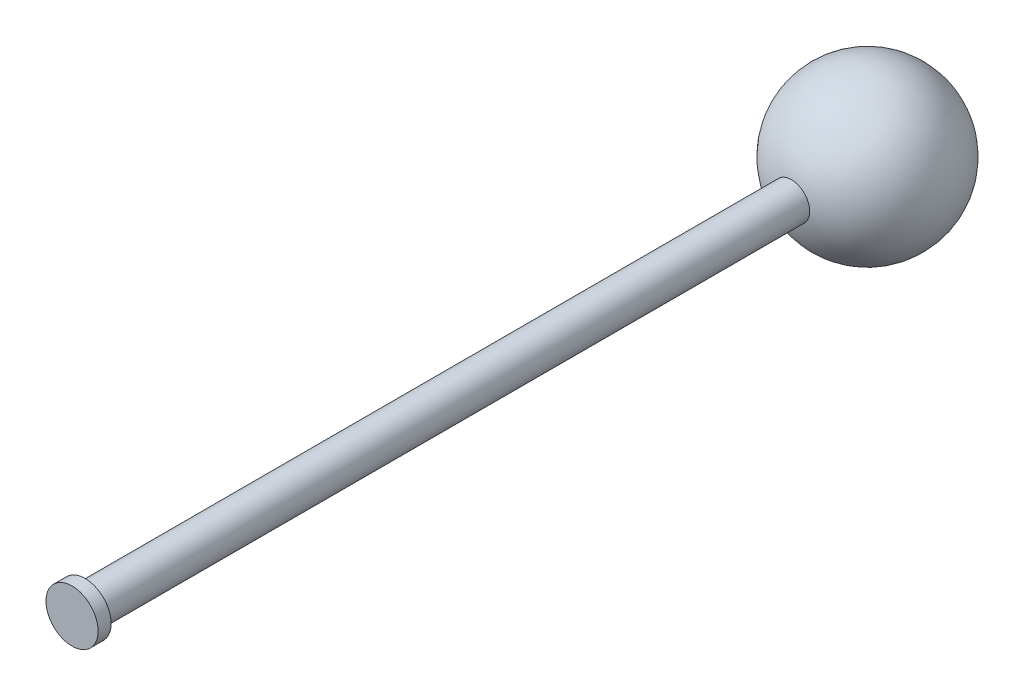
ISO-10303-21;
HEADER;
FILE_DESCRIPTION(('STEP AP214'),'2;1');
FILE_NAME('part.step','',(''),(''),'','','');
FILE_SCHEMA(('AUTOMOTIVE_DESIGN { 1 0 10303 214 1 1 1 1 }'));
ENDSEC;
DATA;
#1=APPLICATION_CONTEXT('core data for automotive mechanical design processes');
#2=APPLICATION_PROTOCOL_DEFINITION('international standard','automotive_design',2000,#1);
#3=PRODUCT_CONTEXT('',#1,'mechanical');
#4=PRODUCT('Part','Part','',(#3));
#5=PRODUCT_RELATED_PRODUCT_CATEGORY('part','',(#4));
#6=PRODUCT_DEFINITION_FORMATION('','',#4);
#7=PRODUCT_DEFINITION_CONTEXT('part definition',#1,'design');
#8=PRODUCT_DEFINITION('design','',#6,#7);
#9=PRODUCT_DEFINITION_SHAPE('','',#8);
#10=(LENGTH_UNIT() NAMED_UNIT(*) SI_UNIT(.MILLI.,.METRE.));
#11=(NAMED_UNIT(*) PLANE_ANGLE_UNIT() SI_UNIT($,.RADIAN.));
#12=(NAMED_UNIT(*) SI_UNIT($,.STERADIAN.) SOLID_ANGLE_UNIT());
#13=UNCERTAINTY_MEASURE_WITH_UNIT(LENGTH_MEASURE(1.E-05),#10,'distance_accuracy_value','');
#14=(GEOMETRIC_REPRESENTATION_CONTEXT(3) GLOBAL_UNCERTAINTY_ASSIGNED_CONTEXT((#13)) GLOBAL_UNIT_ASSIGNED_CONTEXT((#10,
#11,#12)) REPRESENTATION_CONTEXT('',''));
#15=CARTESIAN_POINT('',(0.,0.,0.));
#16=DIRECTION('',(0.,0.,1.));
#17=DIRECTION('',(1.,0.,0.));
#18=AXIS2_PLACEMENT_3D('',#15,#16,#17);
#19=CARTESIAN_POINT('',(0.,0.,0.));
#20=DIRECTION('',(0.,1.,0.));
#21=DIRECTION('',(1.,0.,0.));
#22=AXIS2_PLACEMENT_3D('',#19,#20,#21);
#23=SPHERICAL_SURFACE('',#22,3.);
#24=CARTESIAN_POINT('',(0.,0.,0.));
#25=DIRECTION('',(0.,0.,-1.));
#26=DIRECTION('',(-1.,0.,0.));
#27=AXIS2_PLACEMENT_3D('',#24,#25,#26);
#28=SPHERICAL_SURFACE('',#27,3.);
#29=CARTESIAN_POINT('',(0.,0.,2.91719042916296));
#30=DIRECTION('',(0.,0.,-1.));
#31=DIRECTION('',(-1.,0.,0.));
#32=AXIS2_PLACEMENT_3D('',#29,#30,#31);
#33=CIRCLE('',#32,0.7);
#34=CARTESIAN_POINT('',(-0.7,0.,2.91719042916296));
#35=VERTEX_POINT('',#34);
#36=EDGE_CURVE('E10',#35,#35,#33,.F.);
#37=ORIENTED_EDGE('',*,*,#36,.F.);
#38=EDGE_LOOP('',(#37));
#39=FACE_BOUND('',#38,.T.);
#40=ADVANCED_FACE('F37',(#39),#28,.T.);
#41=CARTESIAN_POINT('',(0.,0.,30.));
#42=DIRECTION('',(0.,0.,-1.));
#43=DIRECTION('',(-1.,0.,0.));
#44=AXIS2_PLACEMENT_3D('',#41,#42,#43);
#45=CYLINDRICAL_SURFACE('',#44,0.7);
#46=CARTESIAN_POINT('',(0.,0.,30.));
#47=DIRECTION('',(0.,0.,1.));
#48=DIRECTION('',(1.,0.,0.));
#49=AXIS2_PLACEMENT_3D('',#46,#47,#48);
#50=CIRCLE('',#49,0.7);
#51=CARTESIAN_POINT('',(0.7,0.,30.));
#52=VERTEX_POINT('',#51);
#53=EDGE_CURVE('E44',#52,#52,#50,.T.);
#54=ORIENTED_EDGE('',*,*,#53,.F.);
#55=EDGE_LOOP('',(#54));
#56=FACE_BOUND('',#55,.T.);
#57=ORIENTED_EDGE('',*,*,#36,.T.);
#58=EDGE_LOOP('',(#57));
#59=FACE_BOUND('',#58,.T.);
#60=ADVANCED_FACE('F74',(#56,#59),#45,.T.);
#61=CARTESIAN_POINT('',(0.,0.,30.5));
#62=DIRECTION('',(0.,0.,-1.));
#63=DIRECTION('',(-1.,0.,0.));
#64=AXIS2_PLACEMENT_3D('',#61,#62,#63);
#65=CYLINDRICAL_SURFACE('',#64,1.);
#66=CARTESIAN_POINT('',(0.,0.,30.5));
#67=DIRECTION('',(0.,0.,1.));
#68=DIRECTION('',(1.,0.,0.));
#69=AXIS2_PLACEMENT_3D('',#66,#67,#68);
#70=CIRCLE('',#69,1.);
#71=CARTESIAN_POINT('',(1.,0.,30.5));
#72=VERTEX_POINT('',#71);
#73=EDGE_CURVE('E49',#72,#72,#70,.T.);
#74=ORIENTED_EDGE('',*,*,#73,.F.);
#75=EDGE_LOOP('',(#74));
#76=FACE_BOUND('',#75,.T.);
#77=CARTESIAN_POINT('',(0.,0.,30.));
#78=DIRECTION('',(0.,0.,1.));
#79=DIRECTION('',(1.,0.,0.));
#80=AXIS2_PLACEMENT_3D('',#77,#78,#79);
#81=CIRCLE('',#80,1.);
#82=CARTESIAN_POINT('',(1.,0.,30.));
#83=VERTEX_POINT('',#82);
#84=EDGE_CURVE('E54',#83,#83,#81,.T.);
#85=ORIENTED_EDGE('',*,*,#84,.T.);
#86=EDGE_LOOP('',(#85));
#87=FACE_BOUND('',#86,.T.);
#88=ADVANCED_FACE('F61',(#76,#87),#65,.T.);
#89=CARTESIAN_POINT('',(0.,0.,30.5));
#90=DIRECTION('',(0.,0.,1.));
#91=DIRECTION('',(1.,0.,0.));
#92=AXIS2_PLACEMENT_3D('',#89,#90,#91);
#93=PLANE('',#92);
#94=ORIENTED_EDGE('',*,*,#73,.T.);
#95=EDGE_LOOP('',(#94));
#96=FACE_BOUND('',#95,.T.);
#97=ADVANCED_FACE('F65',(#96),#93,.T.);
#98=CARTESIAN_POINT('',(0.,0.,30.));
#99=DIRECTION('',(0.,0.,1.));
#100=DIRECTION('',(1.,0.,0.));
#101=AXIS2_PLACEMENT_3D('',#98,#99,#100);
#102=PLANE('',#101);
#103=ORIENTED_EDGE('',*,*,#53,.T.);
#104=EDGE_LOOP('',(#103));
#105=FACE_BOUND('',#104,.T.);
#106=ORIENTED_EDGE('',*,*,#84,.F.);
#107=EDGE_LOOP('',(#106));
#108=FACE_BOUND('',#107,.T.);
#109=ADVANCED_FACE('F63',(#105,#108),#102,.F.);
#110=CLOSED_SHELL('',(#40,#60,#88,#97,#109));
#111=MANIFOLD_SOLID_BREP('B2',#110);
#112=ADVANCED_BREP_SHAPE_REPRESENTATION('',(#18,#111),#14);
#113=SHAPE_DEFINITION_REPRESENTATION(#9,#112);
ENDSEC;
END-ISO-10303-21;
